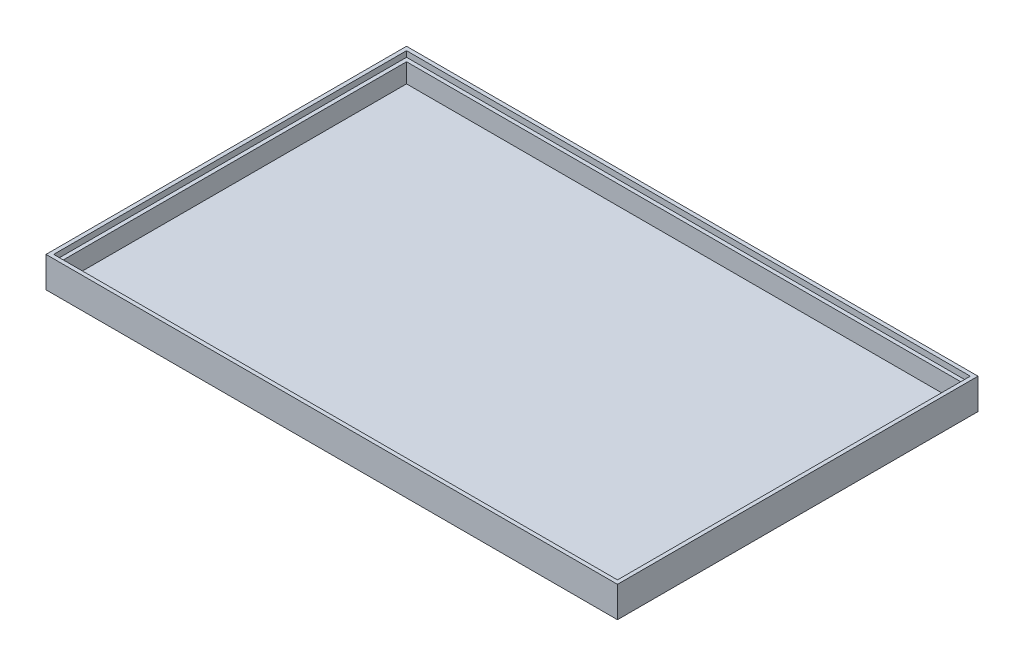
ISO-10303-21;
HEADER;
FILE_DESCRIPTION(('STEP AP214'),'2;1');
FILE_NAME('part.step','',(''),(''),'','','');
FILE_SCHEMA(('AUTOMOTIVE_DESIGN { 1 0 10303 214 1 1 1 1 }'));
ENDSEC;
DATA;
#1=APPLICATION_CONTEXT('core data for automotive mechanical design processes');
#2=APPLICATION_PROTOCOL_DEFINITION('international standard','automotive_design',2000,#1);
#3=PRODUCT_CONTEXT('',#1,'mechanical');
#4=PRODUCT('Part','Part','',(#3));
#5=PRODUCT_RELATED_PRODUCT_CATEGORY('part','',(#4));
#6=PRODUCT_DEFINITION_FORMATION('','',#4);
#7=PRODUCT_DEFINITION_CONTEXT('part definition',#1,'design');
#8=PRODUCT_DEFINITION('design','',#6,#7);
#9=PRODUCT_DEFINITION_SHAPE('','',#8);
#10=(LENGTH_UNIT() NAMED_UNIT(*) SI_UNIT(.MILLI.,.METRE.));
#11=(NAMED_UNIT(*) PLANE_ANGLE_UNIT() SI_UNIT($,.RADIAN.));
#12=(NAMED_UNIT(*) SI_UNIT($,.STERADIAN.) SOLID_ANGLE_UNIT());
#13=UNCERTAINTY_MEASURE_WITH_UNIT(LENGTH_MEASURE(1.E-05),#10,'distance_accuracy_value','');
#14=(GEOMETRIC_REPRESENTATION_CONTEXT(3) GLOBAL_UNCERTAINTY_ASSIGNED_CONTEXT((#13)) GLOBAL_UNIT_ASSIGNED_CONTEXT((#10,
#11,#12)) REPRESENTATION_CONTEXT('',''));
#15=CARTESIAN_POINT('',(0.,0.,0.));
#16=DIRECTION('',(0.,0.,1.));
#17=DIRECTION('',(1.,0.,0.));
#18=AXIS2_PLACEMENT_3D('',#15,#16,#17);
#19=CARTESIAN_POINT('',(0.,8.,0.));
#20=DIRECTION('',(0.,1.,0.));
#21=DIRECTION('',(0.,0.,1.));
#22=AXIS2_PLACEMENT_3D('',#19,#20,#21);
#23=PLANE('',#22);
#24=DIRECTION('',(-1.,0.,0.));
#25=VECTOR('',#24,1.);
#26=CARTESIAN_POINT('',(73.5,8.,-46.));
#27=LINE('',#26,#25);
#28=CARTESIAN_POINT('',(73.5,8.,-46.));
#29=VERTEX_POINT('',#28);
#30=CARTESIAN_POINT('',(-73.5,8.,-46.));
#31=VERTEX_POINT('',#30);
#32=EDGE_CURVE('E56',#29,#31,#27,.T.);
#33=ORIENTED_EDGE('',*,*,#32,.F.);
#34=DIRECTION('',(0.,0.,-1.));
#35=VECTOR('',#34,1.);
#36=CARTESIAN_POINT('',(73.5,8.,46.));
#37=LINE('',#36,#35);
#38=CARTESIAN_POINT('',(73.5,8.,46.));
#39=VERTEX_POINT('',#38);
#40=EDGE_CURVE('E199',#39,#29,#37,.T.);
#41=ORIENTED_EDGE('',*,*,#40,.F.);
#42=DIRECTION('',(1.,0.,0.));
#43=VECTOR('',#42,1.);
#44=CARTESIAN_POINT('',(-73.5,8.,46.));
#45=LINE('',#44,#43);
#46=CARTESIAN_POINT('',(-73.5,8.,46.));
#47=VERTEX_POINT('',#46);
#48=EDGE_CURVE('E203',#47,#39,#45,.T.);
#49=ORIENTED_EDGE('',*,*,#48,.F.);
#50=DIRECTION('',(0.,0.,1.));
#51=VECTOR('',#50,1.);
#52=CARTESIAN_POINT('',(-73.5,8.,-46.));
#53=LINE('',#52,#51);
#54=EDGE_CURVE('E206',#31,#47,#53,.T.);
#55=ORIENTED_EDGE('',*,*,#54,.F.);
#56=EDGE_LOOP('',(#33,#41,#49,#55));
#57=FACE_BOUND('',#56,.T.);
#58=DIRECTION('',(0.,0.,1.));
#59=VECTOR('',#58,1.);
#60=CARTESIAN_POINT('',(-74.5,8.,-47.));
#61=LINE('',#60,#59);
#62=CARTESIAN_POINT('',(-74.5,8.,-47.));
#63=VERTEX_POINT('',#62);
#64=CARTESIAN_POINT('',(-74.5,8.,47.));
#65=VERTEX_POINT('',#64);
#66=EDGE_CURVE('E149',#63,#65,#61,.T.);
#67=ORIENTED_EDGE('',*,*,#66,.T.);
#68=DIRECTION('',(1.,0.,0.));
#69=VECTOR('',#68,1.);
#70=CARTESIAN_POINT('',(-74.5,8.,47.));
#71=LINE('',#70,#69);
#72=CARTESIAN_POINT('',(74.5,8.,47.));
#73=VERTEX_POINT('',#72);
#74=EDGE_CURVE('E152',#65,#73,#71,.T.);
#75=ORIENTED_EDGE('',*,*,#74,.T.);
#76=DIRECTION('',(0.,0.,-1.));
#77=VECTOR('',#76,1.);
#78=CARTESIAN_POINT('',(74.5,8.,47.));
#79=LINE('',#78,#77);
#80=CARTESIAN_POINT('',(74.5,8.,-47.));
#81=VERTEX_POINT('',#80);
#82=EDGE_CURVE('E155',#73,#81,#79,.T.);
#83=ORIENTED_EDGE('',*,*,#82,.T.);
#84=DIRECTION('',(-1.,0.,0.));
#85=VECTOR('',#84,1.);
#86=CARTESIAN_POINT('',(74.5,8.,-47.));
#87=LINE('',#86,#85);
#88=EDGE_CURVE('E157',#81,#63,#87,.T.);
#89=ORIENTED_EDGE('',*,*,#88,.T.);
#90=EDGE_LOOP('',(#67,#75,#83,#89));
#91=FACE_BOUND('',#90,.T.);
#92=ADVANCED_FACE('F33',(#57,#91),#23,.T.);
#93=CARTESIAN_POINT('',(-74.5,8.,-47.));
#94=DIRECTION('',(1.,0.,0.));
#95=DIRECTION('',(0.,0.,-1.));
#96=AXIS2_PLACEMENT_3D('',#93,#94,#95);
#97=PLANE('',#96);
#98=DIRECTION('',(0.,0.,1.));
#99=VECTOR('',#98,1.);
#100=CARTESIAN_POINT('',(-74.5,0.,-47.));
#101=LINE('',#100,#99);
#102=CARTESIAN_POINT('',(-74.5,0.,-47.));
#103=VERTEX_POINT('',#102);
#104=CARTESIAN_POINT('',(-74.5,0.,47.));
#105=VERTEX_POINT('',#104);
#106=EDGE_CURVE('E139',#103,#105,#101,.T.);
#107=ORIENTED_EDGE('',*,*,#106,.T.);
#108=DIRECTION('',(0.,-1.,0.));
#109=VECTOR('',#108,1.);
#110=CARTESIAN_POINT('',(-74.5,8.,47.));
#111=LINE('',#110,#109);
#112=EDGE_CURVE('E172',#65,#105,#111,.T.);
#113=ORIENTED_EDGE('',*,*,#112,.F.);
#114=ORIENTED_EDGE('',*,*,#66,.F.);
#115=DIRECTION('',(0.,-1.,0.));
#116=VECTOR('',#115,1.);
#117=CARTESIAN_POINT('',(-74.5,8.,-47.));
#118=LINE('',#117,#116);
#119=EDGE_CURVE('E158',#63,#103,#118,.T.);
#120=ORIENTED_EDGE('',*,*,#119,.T.);
#121=EDGE_LOOP('',(#107,#113,#114,#120));
#122=FACE_BOUND('',#121,.T.);
#123=ADVANCED_FACE('F232',(#122),#97,.F.);
#124=CARTESIAN_POINT('',(-74.5,8.,47.));
#125=DIRECTION('',(0.,0.,-1.));
#126=DIRECTION('',(-1.,0.,0.));
#127=AXIS2_PLACEMENT_3D('',#124,#125,#126);
#128=PLANE('',#127);
#129=DIRECTION('',(1.,0.,0.));
#130=VECTOR('',#129,1.);
#131=CARTESIAN_POINT('',(-74.5,0.,47.));
#132=LINE('',#131,#130);
#133=CARTESIAN_POINT('',(74.5,0.,47.));
#134=VERTEX_POINT('',#133);
#135=EDGE_CURVE('E143',#105,#134,#132,.T.);
#136=ORIENTED_EDGE('',*,*,#135,.T.);
#137=DIRECTION('',(0.,-1.,0.));
#138=VECTOR('',#137,1.);
#139=CARTESIAN_POINT('',(74.5,8.,47.));
#140=LINE('',#139,#138);
#141=EDGE_CURVE('E169',#73,#134,#140,.T.);
#142=ORIENTED_EDGE('',*,*,#141,.F.);
#143=ORIENTED_EDGE('',*,*,#74,.F.);
#144=ORIENTED_EDGE('',*,*,#112,.T.);
#145=EDGE_LOOP('',(#136,#142,#143,#144));
#146=FACE_BOUND('',#145,.T.);
#147=ADVANCED_FACE('F238',(#146),#128,.F.);
#148=CARTESIAN_POINT('',(74.5,8.,47.));
#149=DIRECTION('',(-1.,0.,0.));
#150=DIRECTION('',(0.,0.,1.));
#151=AXIS2_PLACEMENT_3D('',#148,#149,#150);
#152=PLANE('',#151);
#153=DIRECTION('',(0.,0.,-1.));
#154=VECTOR('',#153,1.);
#155=CARTESIAN_POINT('',(74.5,0.,47.));
#156=LINE('',#155,#154);
#157=CARTESIAN_POINT('',(74.5,0.,-47.));
#158=VERTEX_POINT('',#157);
#159=EDGE_CURVE('E161',#134,#158,#156,.T.);
#160=ORIENTED_EDGE('',*,*,#159,.T.);
#161=DIRECTION('',(0.,-1.,0.));
#162=VECTOR('',#161,1.);
#163=CARTESIAN_POINT('',(74.5,8.,-47.));
#164=LINE('',#163,#162);
#165=EDGE_CURVE('E166',#81,#158,#164,.T.);
#166=ORIENTED_EDGE('',*,*,#165,.F.);
#167=ORIENTED_EDGE('',*,*,#82,.F.);
#168=ORIENTED_EDGE('',*,*,#141,.T.);
#169=EDGE_LOOP('',(#160,#166,#167,#168));
#170=FACE_BOUND('',#169,.T.);
#171=ADVANCED_FACE('F247',(#170),#152,.F.);
#172=CARTESIAN_POINT('',(74.5,8.,-47.));
#173=DIRECTION('',(0.,0.,1.));
#174=DIRECTION('',(1.,0.,0.));
#175=AXIS2_PLACEMENT_3D('',#172,#173,#174);
#176=PLANE('',#175);
#177=DIRECTION('',(-1.,0.,0.));
#178=VECTOR('',#177,1.);
#179=CARTESIAN_POINT('',(74.5,0.,-47.));
#180=LINE('',#179,#178);
#181=EDGE_CURVE('E153',#158,#103,#180,.T.);
#182=ORIENTED_EDGE('',*,*,#181,.T.);
#183=ORIENTED_EDGE('',*,*,#119,.F.);
#184=ORIENTED_EDGE('',*,*,#88,.F.);
#185=ORIENTED_EDGE('',*,*,#165,.T.);
#186=EDGE_LOOP('',(#182,#183,#184,#185));
#187=FACE_BOUND('',#186,.T.);
#188=ADVANCED_FACE('F244',(#187),#176,.F.);
#189=CARTESIAN_POINT('',(0.,0.,0.));
#190=DIRECTION('',(0.,-1.,0.));
#191=DIRECTION('',(0.,0.,-1.));
#192=AXIS2_PLACEMENT_3D('',#189,#190,#191);
#193=PLANE('',#192);
#194=ORIENTED_EDGE('',*,*,#106,.F.);
#195=ORIENTED_EDGE('',*,*,#181,.F.);
#196=ORIENTED_EDGE('',*,*,#159,.F.);
#197=ORIENTED_EDGE('',*,*,#135,.F.);
#198=EDGE_LOOP('',(#194,#195,#196,#197));
#199=FACE_BOUND('',#198,.T.);
#200=ADVANCED_FACE('F35',(#199),#193,.T.);
#201=CARTESIAN_POINT('',(73.5,6.5,-46.));
#202=DIRECTION('',(0.,0.,-1.));
#203=DIRECTION('',(-1.,0.,0.));
#204=AXIS2_PLACEMENT_3D('',#201,#202,#203);
#205=PLANE('',#204);
#206=ORIENTED_EDGE('',*,*,#32,.T.);
#207=DIRECTION('',(0.,1.,0.));
#208=VECTOR('',#207,1.);
#209=CARTESIAN_POINT('',(-73.5,6.5,-46.));
#210=LINE('',#209,#208);
#211=CARTESIAN_POINT('',(-73.5,6.5,-46.));
#212=VERTEX_POINT('',#211);
#213=EDGE_CURVE('E193',#212,#31,#210,.T.);
#214=ORIENTED_EDGE('',*,*,#213,.F.);
#215=DIRECTION('',(-1.,0.,0.));
#216=VECTOR('',#215,1.);
#217=CARTESIAN_POINT('',(73.5,6.5,-46.));
#218=LINE('',#217,#216);
#219=CARTESIAN_POINT('',(73.5,6.5,-46.));
#220=VERTEX_POINT('',#219);
#221=EDGE_CURVE('E202',#220,#212,#218,.T.);
#222=ORIENTED_EDGE('',*,*,#221,.F.);
#223=DIRECTION('',(0.,1.,0.));
#224=VECTOR('',#223,1.);
#225=CARTESIAN_POINT('',(73.5,6.5,-46.));
#226=LINE('',#225,#224);
#227=EDGE_CURVE('E188',#220,#29,#226,.T.);
#228=ORIENTED_EDGE('',*,*,#227,.T.);
#229=EDGE_LOOP('',(#206,#214,#222,#228));
#230=FACE_BOUND('',#229,.T.);
#231=ADVANCED_FACE('F270',(#230),#205,.F.);
#232=CARTESIAN_POINT('',(73.5,6.5,46.));
#233=DIRECTION('',(1.,0.,0.));
#234=DIRECTION('',(0.,0.,-1.));
#235=AXIS2_PLACEMENT_3D('',#232,#233,#234);
#236=PLANE('',#235);
#237=ORIENTED_EDGE('',*,*,#40,.T.);
#238=ORIENTED_EDGE('',*,*,#227,.F.);
#239=DIRECTION('',(0.,0.,-1.));
#240=VECTOR('',#239,1.);
#241=CARTESIAN_POINT('',(73.5,6.5,46.));
#242=LINE('',#241,#240);
#243=CARTESIAN_POINT('',(73.5,6.5,46.));
#244=VERTEX_POINT('',#243);
#245=EDGE_CURVE('E196',#244,#220,#242,.T.);
#246=ORIENTED_EDGE('',*,*,#245,.F.);
#247=DIRECTION('',(0.,1.,0.));
#248=VECTOR('',#247,1.);
#249=CARTESIAN_POINT('',(73.5,6.5,46.));
#250=LINE('',#249,#248);
#251=EDGE_CURVE('E190',#244,#39,#250,.T.);
#252=ORIENTED_EDGE('',*,*,#251,.T.);
#253=EDGE_LOOP('',(#237,#238,#246,#252));
#254=FACE_BOUND('',#253,.T.);
#255=ADVANCED_FACE('F267',(#254),#236,.F.);
#256=CARTESIAN_POINT('',(-73.5,6.5,46.));
#257=DIRECTION('',(0.,0.,1.));
#258=DIRECTION('',(1.,0.,0.));
#259=AXIS2_PLACEMENT_3D('',#256,#257,#258);
#260=PLANE('',#259);
#261=ORIENTED_EDGE('',*,*,#48,.T.);
#262=ORIENTED_EDGE('',*,*,#251,.F.);
#263=DIRECTION('',(1.,0.,0.));
#264=VECTOR('',#263,1.);
#265=CARTESIAN_POINT('',(-73.5,6.5,46.));
#266=LINE('',#265,#264);
#267=CARTESIAN_POINT('',(-73.5,6.5,46.));
#268=VERTEX_POINT('',#267);
#269=EDGE_CURVE('E212',#268,#244,#266,.T.);
#270=ORIENTED_EDGE('',*,*,#269,.F.);
#271=DIRECTION('',(0.,1.,0.));
#272=VECTOR('',#271,1.);
#273=CARTESIAN_POINT('',(-73.5,6.5,46.));
#274=LINE('',#273,#272);
#275=EDGE_CURVE('E195',#268,#47,#274,.T.);
#276=ORIENTED_EDGE('',*,*,#275,.T.);
#277=EDGE_LOOP('',(#261,#262,#270,#276));
#278=FACE_BOUND('',#277,.T.);
#279=ADVANCED_FACE('F263',(#278),#260,.F.);
#280=CARTESIAN_POINT('',(-73.5,6.5,-46.));
#281=DIRECTION('',(-1.,0.,0.));
#282=DIRECTION('',(0.,0.,1.));
#283=AXIS2_PLACEMENT_3D('',#280,#281,#282);
#284=PLANE('',#283);
#285=ORIENTED_EDGE('',*,*,#54,.T.);
#286=ORIENTED_EDGE('',*,*,#275,.F.);
#287=DIRECTION('',(0.,0.,1.));
#288=VECTOR('',#287,1.);
#289=CARTESIAN_POINT('',(-73.5,6.5,-46.));
#290=LINE('',#289,#288);
#291=EDGE_CURVE('E215',#212,#268,#290,.T.);
#292=ORIENTED_EDGE('',*,*,#291,.F.);
#293=ORIENTED_EDGE('',*,*,#213,.T.);
#294=EDGE_LOOP('',(#285,#286,#292,#293));
#295=FACE_BOUND('',#294,.T.);
#296=ADVANCED_FACE('F258',(#295),#284,.F.);
#297=CARTESIAN_POINT('',(0.,6.5,0.));
#298=DIRECTION('',(0.,1.,0.));
#299=DIRECTION('',(0.,0.,1.));
#300=AXIS2_PLACEMENT_3D('',#297,#298,#299);
#301=PLANE('',#300);
#302=DIRECTION('',(-1.,0.,0.));
#303=VECTOR('',#302,1.);
#304=CARTESIAN_POINT('',(72.5,6.5,-45.));
#305=LINE('',#304,#303);
#306=CARTESIAN_POINT('',(72.5,6.5,-45.));
#307=VERTEX_POINT('',#306);
#308=CARTESIAN_POINT('',(-72.5,6.5,-45.));
#309=VERTEX_POINT('',#308);
#310=EDGE_CURVE('E187',#307,#309,#305,.T.);
#311=ORIENTED_EDGE('',*,*,#310,.F.);
#312=DIRECTION('',(0.,0.,-1.));
#313=VECTOR('',#312,1.);
#314=CARTESIAN_POINT('',(72.5,6.5,45.));
#315=LINE('',#314,#313);
#316=CARTESIAN_POINT('',(72.5,6.5,45.));
#317=VERTEX_POINT('',#316);
#318=EDGE_CURVE('E124',#317,#307,#315,.T.);
#319=ORIENTED_EDGE('',*,*,#318,.F.);
#320=DIRECTION('',(1.,0.,0.));
#321=VECTOR('',#320,1.);
#322=CARTESIAN_POINT('',(-72.5,6.5,45.));
#323=LINE('',#322,#321);
#324=CARTESIAN_POINT('',(-72.5,6.5,45.));
#325=VERTEX_POINT('',#324);
#326=EDGE_CURVE('E120',#325,#317,#323,.T.);
#327=ORIENTED_EDGE('',*,*,#326,.F.);
#328=DIRECTION('',(0.,0.,1.));
#329=VECTOR('',#328,1.);
#330=CARTESIAN_POINT('',(-72.5,6.5,-45.));
#331=LINE('',#330,#329);
#332=EDGE_CURVE('E48',#309,#325,#331,.T.);
#333=ORIENTED_EDGE('',*,*,#332,.F.);
#334=EDGE_LOOP('',(#311,#319,#327,#333));
#335=FACE_BOUND('',#334,.T.);
#336=ORIENTED_EDGE('',*,*,#221,.T.);
#337=ORIENTED_EDGE('',*,*,#291,.T.);
#338=ORIENTED_EDGE('',*,*,#269,.T.);
#339=ORIENTED_EDGE('',*,*,#245,.T.);
#340=EDGE_LOOP('',(#336,#337,#338,#339));
#341=FACE_BOUND('',#340,.T.);
#342=ADVANCED_FACE('F121',(#335,#341),#301,.T.);
#343=CARTESIAN_POINT('',(0.,1.5,0.));
#344=DIRECTION('',(0.,-1.,0.));
#345=DIRECTION('',(0.,0.,-1.));
#346=AXIS2_PLACEMENT_3D('',#343,#344,#345);
#347=PLANE('',#346);
#348=DIRECTION('',(0.,0.,-1.));
#349=VECTOR('',#348,1.);
#350=CARTESIAN_POINT('',(72.5,1.5,45.));
#351=LINE('',#350,#349);
#352=CARTESIAN_POINT('',(72.5,1.5,45.));
#353=VERTEX_POINT('',#352);
#354=CARTESIAN_POINT('',(72.5,1.5,-45.));
#355=VERTEX_POINT('',#354);
#356=EDGE_CURVE('E175',#353,#355,#351,.T.);
#357=ORIENTED_EDGE('',*,*,#356,.T.);
#358=DIRECTION('',(-1.,0.,0.));
#359=VECTOR('',#358,1.);
#360=CARTESIAN_POINT('',(-72.5,1.5,-45.));
#361=LINE('',#360,#359);
#362=CARTESIAN_POINT('',(-72.5,1.5,-45.));
#363=VERTEX_POINT('',#362);
#364=EDGE_CURVE('E178',#355,#363,#361,.T.);
#365=ORIENTED_EDGE('',*,*,#364,.T.);
#366=DIRECTION('',(0.,0.,1.));
#367=VECTOR('',#366,1.);
#368=CARTESIAN_POINT('',(-72.5,1.5,45.));
#369=LINE('',#368,#367);
#370=CARTESIAN_POINT('',(-72.5,1.5,45.));
#371=VERTEX_POINT('',#370);
#372=EDGE_CURVE('E41',#363,#371,#369,.T.);
#373=ORIENTED_EDGE('',*,*,#372,.T.);
#374=DIRECTION('',(1.,0.,0.));
#375=VECTOR('',#374,1.);
#376=CARTESIAN_POINT('',(-72.5,1.5,45.));
#377=LINE('',#376,#375);
#378=EDGE_CURVE('E11',#371,#353,#377,.T.);
#379=ORIENTED_EDGE('',*,*,#378,.T.);
#380=EDGE_LOOP('',(#357,#365,#373,#379));
#381=FACE_BOUND('',#380,.T.);
#382=ADVANCED_FACE('F181',(#381),#347,.F.);
#383=CARTESIAN_POINT('',(72.5,8.,-45.));
#384=DIRECTION('',(0.,0.,1.));
#385=DIRECTION('',(1.,0.,0.));
#386=AXIS2_PLACEMENT_3D('',#383,#384,#385);
#387=PLANE('',#386);
#388=DIRECTION('',(0.,-1.,0.));
#389=VECTOR('',#388,1.);
#390=CARTESIAN_POINT('',(72.5,8.,-45.));
#391=LINE('',#390,#389);
#392=EDGE_CURVE('E145',#307,#355,#391,.T.);
#393=ORIENTED_EDGE('',*,*,#392,.F.);
#394=ORIENTED_EDGE('',*,*,#310,.T.);
#395=DIRECTION('',(0.,-1.,0.));
#396=VECTOR('',#395,1.);
#397=CARTESIAN_POINT('',(-72.5,8.,-45.));
#398=LINE('',#397,#396);
#399=EDGE_CURVE('E135',#309,#363,#398,.T.);
#400=ORIENTED_EDGE('',*,*,#399,.T.);
#401=ORIENTED_EDGE('',*,*,#364,.F.);
#402=EDGE_LOOP('',(#393,#394,#400,#401));
#403=FACE_BOUND('',#402,.T.);
#404=ADVANCED_FACE('F186',(#403),#387,.T.);
#405=CARTESIAN_POINT('',(72.5,8.,45.));
#406=DIRECTION('',(-1.,0.,0.));
#407=DIRECTION('',(0.,0.,1.));
#408=AXIS2_PLACEMENT_3D('',#405,#406,#407);
#409=PLANE('',#408);
#410=DIRECTION('',(0.,-1.,0.));
#411=VECTOR('',#410,1.);
#412=CARTESIAN_POINT('',(72.5,8.,45.));
#413=LINE('',#412,#411);
#414=EDGE_CURVE('E140',#317,#353,#413,.T.);
#415=ORIENTED_EDGE('',*,*,#414,.F.);
#416=ORIENTED_EDGE('',*,*,#318,.T.);
#417=ORIENTED_EDGE('',*,*,#392,.T.);
#418=ORIENTED_EDGE('',*,*,#356,.F.);
#419=EDGE_LOOP('',(#415,#416,#417,#418));
#420=FACE_BOUND('',#419,.T.);
#421=ADVANCED_FACE('F222',(#420),#409,.T.);
#422=CARTESIAN_POINT('',(-72.5,8.,45.));
#423=DIRECTION('',(0.,0.,-1.));
#424=DIRECTION('',(-1.,0.,0.));
#425=AXIS2_PLACEMENT_3D('',#422,#423,#424);
#426=PLANE('',#425);
#427=DIRECTION('',(0.,-1.,0.));
#428=VECTOR('',#427,1.);
#429=CARTESIAN_POINT('',(-72.5,8.,45.));
#430=LINE('',#429,#428);
#431=EDGE_CURVE('E133',#325,#371,#430,.T.);
#432=ORIENTED_EDGE('',*,*,#431,.F.);
#433=ORIENTED_EDGE('',*,*,#326,.T.);
#434=ORIENTED_EDGE('',*,*,#414,.T.);
#435=ORIENTED_EDGE('',*,*,#378,.F.);
#436=EDGE_LOOP('',(#432,#433,#434,#435));
#437=FACE_BOUND('',#436,.T.);
#438=ADVANCED_FACE('F137',(#437),#426,.T.);
#439=CARTESIAN_POINT('',(-72.5,8.,-45.));
#440=DIRECTION('',(1.,0.,0.));
#441=DIRECTION('',(0.,0.,-1.));
#442=AXIS2_PLACEMENT_3D('',#439,#440,#441);
#443=PLANE('',#442);
#444=ORIENTED_EDGE('',*,*,#399,.F.);
#445=ORIENTED_EDGE('',*,*,#332,.T.);
#446=ORIENTED_EDGE('',*,*,#431,.T.);
#447=ORIENTED_EDGE('',*,*,#372,.F.);
#448=EDGE_LOOP('',(#444,#445,#446,#447));
#449=FACE_BOUND('',#448,.T.);
#450=ADVANCED_FACE('F131',(#449),#443,.T.);
#451=CLOSED_SHELL('',(#92,#123,#147,#171,#188,#200,#231,#255,#279,#296,#342,#382,#404,#421,#438,#450));
#452=MANIFOLD_SOLID_BREP('B2',#451);
#453=ADVANCED_BREP_SHAPE_REPRESENTATION('',(#18,#452),#14);
#454=SHAPE_DEFINITION_REPRESENTATION(#9,#453);
ENDSEC;
END-ISO-10303-21;
